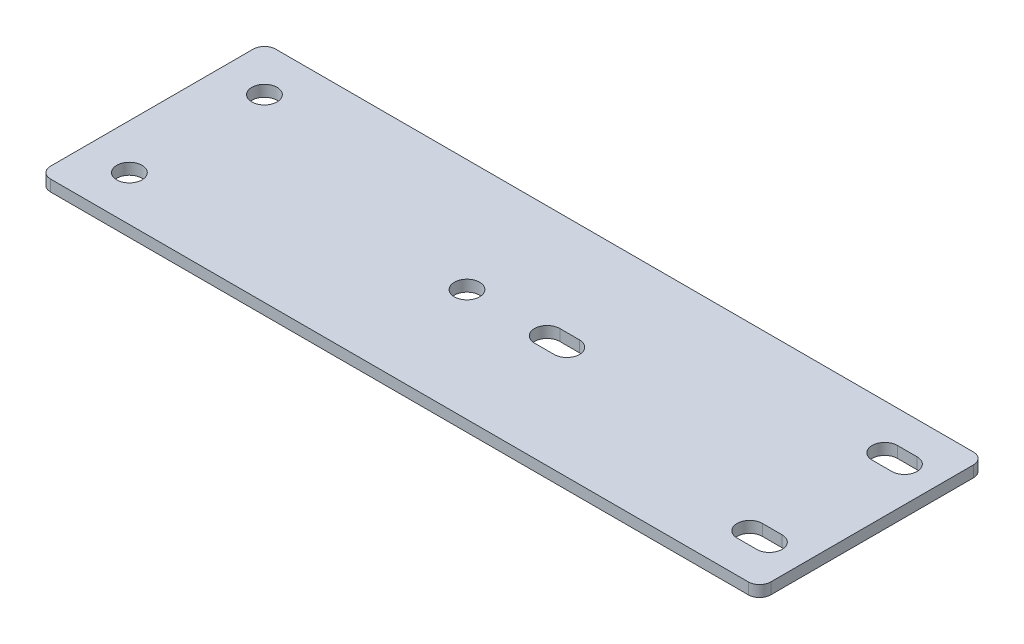
ISO-10303-21;
HEADER;
FILE_DESCRIPTION(('STEP AP214'),'2;1');
FILE_NAME('part.step','',(''),(''),'','','');
FILE_SCHEMA(('AUTOMOTIVE_DESIGN { 1 0 10303 214 1 1 1 1 }'));
ENDSEC;
DATA;
#1=APPLICATION_CONTEXT('core data for automotive mechanical design processes');
#2=APPLICATION_PROTOCOL_DEFINITION('international standard','automotive_design',2000,#1);
#3=PRODUCT_CONTEXT('',#1,'mechanical');
#4=PRODUCT('Part','Part','',(#3));
#5=PRODUCT_RELATED_PRODUCT_CATEGORY('part','',(#4));
#6=PRODUCT_DEFINITION_FORMATION('','',#4);
#7=PRODUCT_DEFINITION_CONTEXT('part definition',#1,'design');
#8=PRODUCT_DEFINITION('design','',#6,#7);
#9=PRODUCT_DEFINITION_SHAPE('','',#8);
#10=(LENGTH_UNIT() NAMED_UNIT(*) SI_UNIT(.MILLI.,.METRE.));
#11=(NAMED_UNIT(*) PLANE_ANGLE_UNIT() SI_UNIT($,.RADIAN.));
#12=(NAMED_UNIT(*) SI_UNIT($,.STERADIAN.) SOLID_ANGLE_UNIT());
#13=UNCERTAINTY_MEASURE_WITH_UNIT(LENGTH_MEASURE(1.E-05),#10,'distance_accuracy_value','');
#14=(GEOMETRIC_REPRESENTATION_CONTEXT(3) GLOBAL_UNCERTAINTY_ASSIGNED_CONTEXT((#13)) GLOBAL_UNIT_ASSIGNED_CONTEXT((#10,
#11,#12)) REPRESENTATION_CONTEXT('',''));
#15=CARTESIAN_POINT('',(0.,0.,0.));
#16=DIRECTION('',(0.,0.,1.));
#17=DIRECTION('',(1.,0.,0.));
#18=AXIS2_PLACEMENT_3D('',#15,#16,#17);
#19=CARTESIAN_POINT('',(0.,3.175,0.));
#20=DIRECTION('',(1.,0.,0.));
#21=DIRECTION('',(0.,0.,-1.));
#22=AXIS2_PLACEMENT_3D('',#19,#20,#21);
#23=PLANE('',#22);
#24=DIRECTION('',(0.,0.,1.));
#25=VECTOR('',#24,1.);
#26=CARTESIAN_POINT('',(0.,3.175,0.));
#27=LINE('',#26,#25);
#28=CARTESIAN_POINT('',(0.,3.175,-60.325));
#29=VERTEX_POINT('',#28);
#30=CARTESIAN_POINT('',(0.,3.175,-3.175));
#31=VERTEX_POINT('',#30);
#32=EDGE_CURVE('E515',#29,#31,#27,.T.);
#33=ORIENTED_EDGE('',*,*,#32,.F.);
#34=DIRECTION('',(0.,-1.,0.));
#35=VECTOR('',#34,1.);
#36=CARTESIAN_POINT('',(0.,3.175,-60.325));
#37=LINE('',#36,#35);
#38=CARTESIAN_POINT('',(0.,0.,-60.325));
#39=VERTEX_POINT('',#38);
#40=EDGE_CURVE('E537',#29,#39,#37,.T.);
#41=ORIENTED_EDGE('',*,*,#40,.T.);
#42=DIRECTION('',(0.,0.,1.));
#43=VECTOR('',#42,1.);
#44=CARTESIAN_POINT('',(0.,0.,0.));
#45=LINE('',#44,#43);
#46=CARTESIAN_POINT('',(0.,0.,-3.175));
#47=VERTEX_POINT('',#46);
#48=EDGE_CURVE('E514',#39,#47,#45,.T.);
#49=ORIENTED_EDGE('',*,*,#48,.T.);
#50=DIRECTION('',(0.,-1.,0.));
#51=VECTOR('',#50,1.);
#52=CARTESIAN_POINT('',(0.,3.175,-3.175));
#53=LINE('',#52,#51);
#54=EDGE_CURVE('E526',#47,#31,#53,.F.);
#55=ORIENTED_EDGE('',*,*,#54,.T.);
#56=EDGE_LOOP('',(#33,#41,#49,#55));
#57=FACE_BOUND('',#56,.T.);
#58=ADVANCED_FACE('F255',(#57),#23,.F.);
#59=CARTESIAN_POINT('',(0.,3.175,0.));
#60=DIRECTION('',(0.,0.,-1.));
#61=DIRECTION('',(-1.,0.,0.));
#62=AXIS2_PLACEMENT_3D('',#59,#60,#61);
#63=PLANE('',#62);
#64=DIRECTION('',(1.,0.,0.));
#65=VECTOR('',#64,1.);
#66=CARTESIAN_POINT('',(0.,3.175,0.));
#67=LINE('',#66,#65);
#68=CARTESIAN_POINT('',(3.175,3.175,0.));
#69=VERTEX_POINT('',#68);
#70=CARTESIAN_POINT('',(200.025,3.175,0.));
#71=VERTEX_POINT('',#70);
#72=EDGE_CURVE('E518',#69,#71,#67,.T.);
#73=ORIENTED_EDGE('',*,*,#72,.F.);
#74=DIRECTION('',(0.,-1.,0.));
#75=VECTOR('',#74,1.);
#76=CARTESIAN_POINT('',(3.175,3.175,0.));
#77=LINE('',#76,#75);
#78=CARTESIAN_POINT('',(3.175,0.,0.));
#79=VERTEX_POINT('',#78);
#80=EDGE_CURVE('E562',#69,#79,#77,.T.);
#81=ORIENTED_EDGE('',*,*,#80,.T.);
#82=DIRECTION('',(1.,0.,0.));
#83=VECTOR('',#82,1.);
#84=CARTESIAN_POINT('',(0.,0.,0.));
#85=LINE('',#84,#83);
#86=CARTESIAN_POINT('',(200.025,0.,0.));
#87=VERTEX_POINT('',#86);
#88=EDGE_CURVE('E529',#79,#87,#85,.T.);
#89=ORIENTED_EDGE('',*,*,#88,.T.);
#90=DIRECTION('',(0.,-1.,0.));
#91=VECTOR('',#90,1.);
#92=CARTESIAN_POINT('',(200.025,3.175,0.));
#93=LINE('',#92,#91);
#94=EDGE_CURVE('E560',#87,#71,#93,.F.);
#95=ORIENTED_EDGE('',*,*,#94,.T.);
#96=EDGE_LOOP('',(#73,#81,#89,#95));
#97=FACE_BOUND('',#96,.T.);
#98=ADVANCED_FACE('F595',(#97),#63,.F.);
#99=CARTESIAN_POINT('',(203.2,3.175,0.));
#100=DIRECTION('',(-1.,0.,0.));
#101=DIRECTION('',(0.,0.,1.));
#102=AXIS2_PLACEMENT_3D('',#99,#100,#101);
#103=PLANE('',#102);
#104=DIRECTION('',(0.,0.,-1.));
#105=VECTOR('',#104,1.);
#106=CARTESIAN_POINT('',(203.2,0.,0.));
#107=LINE('',#106,#105);
#108=CARTESIAN_POINT('',(203.2,0.,-3.175));
#109=VERTEX_POINT('',#108);
#110=CARTESIAN_POINT('',(203.2,0.,-60.325));
#111=VERTEX_POINT('',#110);
#112=EDGE_CURVE('E532',#109,#111,#107,.T.);
#113=ORIENTED_EDGE('',*,*,#112,.T.);
#114=DIRECTION('',(0.,-1.,0.));
#115=VECTOR('',#114,1.);
#116=CARTESIAN_POINT('',(203.2,3.175,-60.325));
#117=LINE('',#116,#115);
#118=CARTESIAN_POINT('',(203.2,3.175,-60.325));
#119=VERTEX_POINT('',#118);
#120=EDGE_CURVE('E13',#111,#119,#117,.F.);
#121=ORIENTED_EDGE('',*,*,#120,.T.);
#122=DIRECTION('',(0.,0.,-1.));
#123=VECTOR('',#122,1.);
#124=CARTESIAN_POINT('',(203.2,3.175,0.));
#125=LINE('',#124,#123);
#126=CARTESIAN_POINT('',(203.2,3.175,-3.175));
#127=VERTEX_POINT('',#126);
#128=EDGE_CURVE('E521',#127,#119,#125,.T.);
#129=ORIENTED_EDGE('',*,*,#128,.F.);
#130=DIRECTION('',(0.,-1.,0.));
#131=VECTOR('',#130,1.);
#132=CARTESIAN_POINT('',(203.2,3.175,-3.175));
#133=LINE('',#132,#131);
#134=EDGE_CURVE('E263',#127,#109,#133,.T.);
#135=ORIENTED_EDGE('',*,*,#134,.T.);
#136=EDGE_LOOP('',(#113,#121,#129,#135));
#137=FACE_BOUND('',#136,.T.);
#138=ADVANCED_FACE('F567',(#137),#103,.F.);
#139=CARTESIAN_POINT('',(0.,3.175,-63.5));
#140=DIRECTION('',(0.,0.,1.));
#141=DIRECTION('',(1.,0.,0.));
#142=AXIS2_PLACEMENT_3D('',#139,#140,#141);
#143=PLANE('',#142);
#144=DIRECTION('',(-1.,0.,0.));
#145=VECTOR('',#144,1.);
#146=CARTESIAN_POINT('',(0.,0.,-63.5));
#147=LINE('',#146,#145);
#148=CARTESIAN_POINT('',(200.025,0.,-63.5));
#149=VERTEX_POINT('',#148);
#150=CARTESIAN_POINT('',(3.175,0.,-63.5));
#151=VERTEX_POINT('',#150);
#152=EDGE_CURVE('E519',#149,#151,#147,.T.);
#153=ORIENTED_EDGE('',*,*,#152,.T.);
#154=DIRECTION('',(0.,-1.,0.));
#155=VECTOR('',#154,1.);
#156=CARTESIAN_POINT('',(3.175,3.175,-63.5));
#157=LINE('',#156,#155);
#158=CARTESIAN_POINT('',(3.175,3.175,-63.5));
#159=VERTEX_POINT('',#158);
#160=EDGE_CURVE('E551',#151,#159,#157,.F.);
#161=ORIENTED_EDGE('',*,*,#160,.T.);
#162=DIRECTION('',(-1.,0.,0.));
#163=VECTOR('',#162,1.);
#164=CARTESIAN_POINT('',(0.,3.175,-63.5));
#165=LINE('',#164,#163);
#166=CARTESIAN_POINT('',(200.025,3.175,-63.5));
#167=VERTEX_POINT('',#166);
#168=EDGE_CURVE('E523',#167,#159,#165,.T.);
#169=ORIENTED_EDGE('',*,*,#168,.F.);
#170=DIRECTION('',(0.,-1.,0.));
#171=VECTOR('',#170,1.);
#172=CARTESIAN_POINT('',(200.025,3.175,-63.5));
#173=LINE('',#172,#171);
#174=EDGE_CURVE('E548',#167,#149,#173,.T.);
#175=ORIENTED_EDGE('',*,*,#174,.T.);
#176=EDGE_LOOP('',(#153,#161,#169,#175));
#177=FACE_BOUND('',#176,.T.);
#178=ADVANCED_FACE('F580',(#177),#143,.F.);
#179=CARTESIAN_POINT('',(0.,3.175,0.));
#180=DIRECTION('',(0.,-1.,0.));
#181=DIRECTION('',(0.,0.,-1.));
#182=AXIS2_PLACEMENT_3D('',#179,#180,#181);
#183=PLANE('',#182);
#184=DIRECTION('',(1.,0.,0.));
#185=VECTOR('',#184,1.);
#186=CARTESIAN_POINT('',(111.521875,3.175,-28.178125));
#187=LINE('',#186,#185);
#188=CARTESIAN_POINT('',(111.521875,3.175,-28.178125));
#189=VERTEX_POINT('',#188);
#190=CARTESIAN_POINT('',(117.078125,3.175,-28.178125));
#191=VERTEX_POINT('',#190);
#192=EDGE_CURVE('E418',#189,#191,#187,.T.);
#193=ORIENTED_EDGE('',*,*,#192,.F.);
#194=CARTESIAN_POINT('',(111.521875,3.175,-31.75));
#195=DIRECTION('',(0.,1.,0.));
#196=DIRECTION('',(0.,0.,1.));
#197=AXIS2_PLACEMENT_3D('',#194,#195,#196);
#198=CIRCLE('',#197,3.571875);
#199=CARTESIAN_POINT('',(111.521875,3.175,-35.321875));
#200=VERTEX_POINT('',#199);
#201=EDGE_CURVE('E403',#200,#189,#198,.T.);
#202=ORIENTED_EDGE('',*,*,#201,.F.);
#203=DIRECTION('',(1.,0.,0.));
#204=VECTOR('',#203,1.);
#205=CARTESIAN_POINT('',(111.521875,3.175,-35.321875));
#206=LINE('',#205,#204);
#207=CARTESIAN_POINT('',(117.078125,3.175,-35.321875));
#208=VERTEX_POINT('',#207);
#209=EDGE_CURVE('E392',#200,#208,#206,.T.);
#210=ORIENTED_EDGE('',*,*,#209,.T.);
#211=CARTESIAN_POINT('',(117.078125,3.175,-31.75));
#212=DIRECTION('',(0.,1.,0.));
#213=DIRECTION('',(0.,0.,1.));
#214=AXIS2_PLACEMENT_3D('',#211,#212,#213);
#215=CIRCLE('',#214,3.571875);
#216=EDGE_CURVE('E412',#191,#208,#215,.T.);
#217=ORIENTED_EDGE('',*,*,#216,.F.);
#218=EDGE_LOOP('',(#193,#202,#210,#217));
#219=FACE_BOUND('',#218,.T.);
#220=DIRECTION('',(1.,0.,0.));
#221=VECTOR('',#220,1.);
#222=CARTESIAN_POINT('',(187.721875,3.175,-54.371875));
#223=LINE('',#222,#221);
#224=CARTESIAN_POINT('',(187.721875,3.175,-54.371875));
#225=VERTEX_POINT('',#224);
#226=CARTESIAN_POINT('',(193.278125,3.175,-54.371875));
#227=VERTEX_POINT('',#226);
#228=EDGE_CURVE('E439',#225,#227,#223,.T.);
#229=ORIENTED_EDGE('',*,*,#228,.T.);
#230=CARTESIAN_POINT('',(193.278125,3.175,-50.8));
#231=DIRECTION('',(0.,1.,0.));
#232=DIRECTION('',(0.,0.,1.));
#233=AXIS2_PLACEMENT_3D('',#230,#231,#232);
#234=CIRCLE('',#233,3.571875);
#235=CARTESIAN_POINT('',(193.278125,3.175,-47.228125));
#236=VERTEX_POINT('',#235);
#237=EDGE_CURVE('E453',#236,#227,#234,.T.);
#238=ORIENTED_EDGE('',*,*,#237,.F.);
#239=DIRECTION('',(1.,0.,0.));
#240=VECTOR('',#239,1.);
#241=CARTESIAN_POINT('',(187.721875,3.175,-47.228125));
#242=LINE('',#241,#240);
#243=CARTESIAN_POINT('',(187.721875,3.175,-47.228125));
#244=VERTEX_POINT('',#243);
#245=EDGE_CURVE('E432',#244,#236,#242,.T.);
#246=ORIENTED_EDGE('',*,*,#245,.F.);
#247=CARTESIAN_POINT('',(187.721875,3.175,-50.8));
#248=DIRECTION('',(0.,1.,0.));
#249=DIRECTION('',(0.,0.,1.));
#250=AXIS2_PLACEMENT_3D('',#247,#248,#249);
#251=CIRCLE('',#250,3.571875);
#252=EDGE_CURVE('E442',#225,#244,#251,.T.);
#253=ORIENTED_EDGE('',*,*,#252,.F.);
#254=EDGE_LOOP('',(#229,#238,#246,#253));
#255=FACE_BOUND('',#254,.T.);
#256=CARTESIAN_POINT('',(187.721875,3.175,-12.7));
#257=DIRECTION('',(0.,1.,0.));
#258=DIRECTION('',(0.,0.,1.));
#259=AXIS2_PLACEMENT_3D('',#256,#257,#258);
#260=CIRCLE('',#259,3.571875);
#261=CARTESIAN_POINT('',(187.721875,3.175,-16.271875));
#262=VERTEX_POINT('',#261);
#263=CARTESIAN_POINT('',(187.721875,3.175,-9.128125));
#264=VERTEX_POINT('',#263);
#265=EDGE_CURVE('E474',#262,#264,#260,.T.);
#266=ORIENTED_EDGE('',*,*,#265,.F.);
#267=DIRECTION('',(1.,0.,0.));
#268=VECTOR('',#267,1.);
#269=CARTESIAN_POINT('',(187.721875,3.175,-16.271875));
#270=LINE('',#269,#268);
#271=CARTESIAN_POINT('',(193.278125,3.175,-16.271875));
#272=VERTEX_POINT('',#271);
#273=EDGE_CURVE('E471',#262,#272,#270,.T.);
#274=ORIENTED_EDGE('',*,*,#273,.T.);
#275=CARTESIAN_POINT('',(193.278125,3.175,-12.7));
#276=DIRECTION('',(0.,1.,0.));
#277=DIRECTION('',(0.,0.,1.));
#278=AXIS2_PLACEMENT_3D('',#275,#276,#277);
#279=CIRCLE('',#278,3.571875);
#280=CARTESIAN_POINT('',(193.278125,3.175,-9.12812499999995));
#281=VERTEX_POINT('',#280);
#282=EDGE_CURVE('E485',#281,#272,#279,.T.);
#283=ORIENTED_EDGE('',*,*,#282,.F.);
#284=DIRECTION('',(1.,0.,0.));
#285=VECTOR('',#284,1.);
#286=CARTESIAN_POINT('',(187.721875,3.175,-9.12812499999995));
#287=LINE('',#286,#285);
#288=EDGE_CURVE('E464',#264,#281,#287,.T.);
#289=ORIENTED_EDGE('',*,*,#288,.F.);
#290=EDGE_LOOP('',(#266,#274,#283,#289));
#291=FACE_BOUND('',#290,.T.);
#292=CARTESIAN_POINT('',(12.7,3.175,-12.7));
#293=DIRECTION('',(0.,1.,0.));
#294=DIRECTION('',(0.,0.,1.));
#295=AXIS2_PLACEMENT_3D('',#292,#293,#294);
#296=CIRCLE('',#295,3.571875);
#297=CARTESIAN_POINT('',(12.7,3.175,-9.128125));
#298=VERTEX_POINT('',#297);
#299=EDGE_CURVE('E496',#298,#298,#296,.T.);
#300=ORIENTED_EDGE('',*,*,#299,.F.);
#301=EDGE_LOOP('',(#300));
#302=FACE_BOUND('',#301,.T.);
#303=CARTESIAN_POINT('',(12.7,3.175,-50.8));
#304=DIRECTION('',(0.,1.,0.));
#305=DIRECTION('',(0.,0.,1.));
#306=AXIS2_PLACEMENT_3D('',#303,#304,#305);
#307=CIRCLE('',#306,3.571875);
#308=CARTESIAN_POINT('',(12.7,3.175,-47.228125));
#309=VERTEX_POINT('',#308);
#310=EDGE_CURVE('E502',#309,#309,#307,.T.);
#311=ORIENTED_EDGE('',*,*,#310,.F.);
#312=EDGE_LOOP('',(#311));
#313=FACE_BOUND('',#312,.T.);
#314=CARTESIAN_POINT('',(88.9,3.175,-31.75));
#315=DIRECTION('',(0.,1.,0.));
#316=DIRECTION('',(0.,0.,1.));
#317=AXIS2_PLACEMENT_3D('',#314,#315,#316);
#318=CIRCLE('',#317,3.571875);
#319=CARTESIAN_POINT('',(88.9,3.175,-28.178125));
#320=VERTEX_POINT('',#319);
#321=EDGE_CURVE('E508',#320,#320,#318,.T.);
#322=ORIENTED_EDGE('',*,*,#321,.F.);
#323=EDGE_LOOP('',(#322));
#324=FACE_BOUND('',#323,.T.);
#325=ORIENTED_EDGE('',*,*,#168,.T.);
#326=CARTESIAN_POINT('',(3.175,3.175,-60.325));
#327=DIRECTION('',(0.,-1.,0.));
#328=DIRECTION('',(0.,0.,-1.));
#329=AXIS2_PLACEMENT_3D('',#326,#327,#328);
#330=CIRCLE('',#329,3.175);
#331=EDGE_CURVE('E558',#159,#29,#330,.F.);
#332=ORIENTED_EDGE('',*,*,#331,.T.);
#333=ORIENTED_EDGE('',*,*,#32,.T.);
#334=CARTESIAN_POINT('',(3.175,3.175,-3.175));
#335=DIRECTION('',(0.,-1.,0.));
#336=DIRECTION('',(0.,0.,-1.));
#337=AXIS2_PLACEMENT_3D('',#334,#335,#336);
#338=CIRCLE('',#337,3.175);
#339=EDGE_CURVE('E556',#31,#69,#338,.F.);
#340=ORIENTED_EDGE('',*,*,#339,.T.);
#341=ORIENTED_EDGE('',*,*,#72,.T.);
#342=CARTESIAN_POINT('',(200.025,3.175,-3.175));
#343=DIRECTION('',(0.,-1.,0.));
#344=DIRECTION('',(0.,0.,-1.));
#345=AXIS2_PLACEMENT_3D('',#342,#343,#344);
#346=CIRCLE('',#345,3.175);
#347=EDGE_CURVE('E275',#71,#127,#346,.F.);
#348=ORIENTED_EDGE('',*,*,#347,.T.);
#349=ORIENTED_EDGE('',*,*,#128,.T.);
#350=CARTESIAN_POINT('',(200.025,3.175,-60.325));
#351=DIRECTION('',(0.,-1.,0.));
#352=DIRECTION('',(0.,0.,-1.));
#353=AXIS2_PLACEMENT_3D('',#350,#351,#352);
#354=CIRCLE('',#353,3.175);
#355=EDGE_CURVE('E554',#119,#167,#354,.F.);
#356=ORIENTED_EDGE('',*,*,#355,.T.);
#357=EDGE_LOOP('',(#325,#332,#333,#340,#341,#348,#349,#356));
#358=FACE_BOUND('',#357,.T.);
#359=ADVANCED_FACE('F416',(#219,#255,#291,#302,#313,#324,#358),#183,.F.);
#360=CARTESIAN_POINT('',(0.,0.,0.));
#361=DIRECTION('',(0.,-1.,0.));
#362=DIRECTION('',(0.,0.,-1.));
#363=AXIS2_PLACEMENT_3D('',#360,#361,#362);
#364=PLANE('',#363);
#365=CARTESIAN_POINT('',(117.078125,0.,-31.75));
#366=DIRECTION('',(0.,1.,0.));
#367=DIRECTION('',(0.,0.,1.));
#368=AXIS2_PLACEMENT_3D('',#365,#366,#367);
#369=CIRCLE('',#368,3.571875);
#370=CARTESIAN_POINT('',(117.078125,0.,-28.178125));
#371=VERTEX_POINT('',#370);
#372=CARTESIAN_POINT('',(117.078125,0.,-35.321875));
#373=VERTEX_POINT('',#372);
#374=EDGE_CURVE('E425',#371,#373,#369,.T.);
#375=ORIENTED_EDGE('',*,*,#374,.T.);
#376=DIRECTION('',(1.,0.,0.));
#377=VECTOR('',#376,1.);
#378=CARTESIAN_POINT('',(111.521875,0.,-35.321875));
#379=LINE('',#378,#377);
#380=CARTESIAN_POINT('',(111.521875,0.,-35.321875));
#381=VERTEX_POINT('',#380);
#382=EDGE_CURVE('E404',#381,#373,#379,.T.);
#383=ORIENTED_EDGE('',*,*,#382,.F.);
#384=CARTESIAN_POINT('',(111.521875,0.,-31.75));
#385=DIRECTION('',(0.,1.,0.));
#386=DIRECTION('',(0.,0.,1.));
#387=AXIS2_PLACEMENT_3D('',#384,#385,#386);
#388=CIRCLE('',#387,3.571875);
#389=CARTESIAN_POINT('',(111.521875,0.,-28.178125));
#390=VERTEX_POINT('',#389);
#391=EDGE_CURVE('E411',#381,#390,#388,.T.);
#392=ORIENTED_EDGE('',*,*,#391,.T.);
#393=DIRECTION('',(1.,0.,0.));
#394=VECTOR('',#393,1.);
#395=CARTESIAN_POINT('',(111.521875,0.,-28.178125));
#396=LINE('',#395,#394);
#397=EDGE_CURVE('E857',#390,#371,#396,.T.);
#398=ORIENTED_EDGE('',*,*,#397,.T.);
#399=EDGE_LOOP('',(#375,#383,#392,#398));
#400=FACE_BOUND('',#399,.T.);
#401=DIRECTION('',(1.,0.,0.));
#402=VECTOR('',#401,1.);
#403=CARTESIAN_POINT('',(187.721875,0.,-47.228125));
#404=LINE('',#403,#402);
#405=CARTESIAN_POINT('',(187.721875,0.,-47.228125));
#406=VERTEX_POINT('',#405);
#407=CARTESIAN_POINT('',(193.278125,0.,-47.228125));
#408=VERTEX_POINT('',#407);
#409=EDGE_CURVE('E434',#406,#408,#404,.T.);
#410=ORIENTED_EDGE('',*,*,#409,.T.);
#411=CARTESIAN_POINT('',(193.278125,0.,-50.8));
#412=DIRECTION('',(0.,1.,0.));
#413=DIRECTION('',(0.,0.,1.));
#414=AXIS2_PLACEMENT_3D('',#411,#412,#413);
#415=CIRCLE('',#414,3.571875);
#416=CARTESIAN_POINT('',(193.278125,0.,-54.371875));
#417=VERTEX_POINT('',#416);
#418=EDGE_CURVE('E456',#408,#417,#415,.T.);
#419=ORIENTED_EDGE('',*,*,#418,.T.);
#420=DIRECTION('',(1.,0.,0.));
#421=VECTOR('',#420,1.);
#422=CARTESIAN_POINT('',(187.721875,0.,-54.371875));
#423=LINE('',#422,#421);
#424=CARTESIAN_POINT('',(187.721875,0.,-54.371875));
#425=VERTEX_POINT('',#424);
#426=EDGE_CURVE('E437',#425,#417,#423,.T.);
#427=ORIENTED_EDGE('',*,*,#426,.F.);
#428=CARTESIAN_POINT('',(187.721875,0.,-50.8));
#429=DIRECTION('',(0.,1.,0.));
#430=DIRECTION('',(0.,0.,1.));
#431=AXIS2_PLACEMENT_3D('',#428,#429,#430);
#432=CIRCLE('',#431,3.571875);
#433=EDGE_CURVE('E444',#425,#406,#432,.T.);
#434=ORIENTED_EDGE('',*,*,#433,.T.);
#435=EDGE_LOOP('',(#410,#419,#427,#434));
#436=FACE_BOUND('',#435,.T.);
#437=DIRECTION('',(1.,0.,0.));
#438=VECTOR('',#437,1.);
#439=CARTESIAN_POINT('',(187.721875,0.,-9.128125));
#440=LINE('',#439,#438);
#441=CARTESIAN_POINT('',(187.721875,0.,-9.128125));
#442=VERTEX_POINT('',#441);
#443=CARTESIAN_POINT('',(193.278125,0.,-9.128125));
#444=VERTEX_POINT('',#443);
#445=EDGE_CURVE('E466',#442,#444,#440,.T.);
#446=ORIENTED_EDGE('',*,*,#445,.T.);
#447=CARTESIAN_POINT('',(193.278125,0.,-12.7));
#448=DIRECTION('',(0.,1.,0.));
#449=DIRECTION('',(0.,0.,1.));
#450=AXIS2_PLACEMENT_3D('',#447,#448,#449);
#451=CIRCLE('',#450,3.571875);
#452=CARTESIAN_POINT('',(193.278125,0.,-16.271875));
#453=VERTEX_POINT('',#452);
#454=EDGE_CURVE('E488',#444,#453,#451,.T.);
#455=ORIENTED_EDGE('',*,*,#454,.T.);
#456=DIRECTION('',(1.,0.,0.));
#457=VECTOR('',#456,1.);
#458=CARTESIAN_POINT('',(187.721875,0.,-16.271875));
#459=LINE('',#458,#457);
#460=CARTESIAN_POINT('',(187.721875,0.,-16.271875));
#461=VERTEX_POINT('',#460);
#462=EDGE_CURVE('E469',#461,#453,#459,.T.);
#463=ORIENTED_EDGE('',*,*,#462,.F.);
#464=CARTESIAN_POINT('',(187.721875,0.,-12.7));
#465=DIRECTION('',(0.,1.,0.));
#466=DIRECTION('',(0.,0.,1.));
#467=AXIS2_PLACEMENT_3D('',#464,#465,#466);
#468=CIRCLE('',#467,3.571875);
#469=EDGE_CURVE('E477',#461,#442,#468,.T.);
#470=ORIENTED_EDGE('',*,*,#469,.T.);
#471=EDGE_LOOP('',(#446,#455,#463,#470));
#472=FACE_BOUND('',#471,.T.);
#473=CARTESIAN_POINT('',(12.7,0.,-12.7));
#474=DIRECTION('',(0.,1.,0.));
#475=DIRECTION('',(0.,0.,1.));
#476=AXIS2_PLACEMENT_3D('',#473,#474,#475);
#477=CIRCLE('',#476,3.571875);
#478=CARTESIAN_POINT('',(12.7,0.,-9.128125));
#479=VERTEX_POINT('',#478);
#480=EDGE_CURVE('E499',#479,#479,#477,.T.);
#481=ORIENTED_EDGE('',*,*,#480,.T.);
#482=EDGE_LOOP('',(#481));
#483=FACE_BOUND('',#482,.T.);
#484=CARTESIAN_POINT('',(12.7,0.,-50.8));
#485=DIRECTION('',(0.,1.,0.));
#486=DIRECTION('',(0.,0.,1.));
#487=AXIS2_PLACEMENT_3D('',#484,#485,#486);
#488=CIRCLE('',#487,3.571875);
#489=CARTESIAN_POINT('',(12.7,0.,-47.228125));
#490=VERTEX_POINT('',#489);
#491=EDGE_CURVE('E505',#490,#490,#488,.T.);
#492=ORIENTED_EDGE('',*,*,#491,.T.);
#493=EDGE_LOOP('',(#492));
#494=FACE_BOUND('',#493,.T.);
#495=CARTESIAN_POINT('',(88.9,0.,-31.75));
#496=DIRECTION('',(0.,1.,0.));
#497=DIRECTION('',(0.,0.,1.));
#498=AXIS2_PLACEMENT_3D('',#495,#496,#497);
#499=CIRCLE('',#498,3.571875);
#500=CARTESIAN_POINT('',(88.9,0.,-28.178125));
#501=VERTEX_POINT('',#500);
#502=EDGE_CURVE('E511',#501,#501,#499,.T.);
#503=ORIENTED_EDGE('',*,*,#502,.T.);
#504=EDGE_LOOP('',(#503));
#505=FACE_BOUND('',#504,.T.);
#506=ORIENTED_EDGE('',*,*,#48,.F.);
#507=CARTESIAN_POINT('',(3.175,0.,-60.325));
#508=DIRECTION('',(0.,-1.,0.));
#509=DIRECTION('',(0.,0.,-1.));
#510=AXIS2_PLACEMENT_3D('',#507,#508,#509);
#511=CIRCLE('',#510,3.175);
#512=EDGE_CURVE('E546',#39,#151,#511,.T.);
#513=ORIENTED_EDGE('',*,*,#512,.T.);
#514=ORIENTED_EDGE('',*,*,#152,.F.);
#515=CARTESIAN_POINT('',(200.025,0.,-60.325));
#516=DIRECTION('',(0.,-1.,0.));
#517=DIRECTION('',(0.,0.,-1.));
#518=AXIS2_PLACEMENT_3D('',#515,#516,#517);
#519=CIRCLE('',#518,3.175);
#520=EDGE_CURVE('E542',#149,#111,#519,.T.);
#521=ORIENTED_EDGE('',*,*,#520,.T.);
#522=ORIENTED_EDGE('',*,*,#112,.F.);
#523=CARTESIAN_POINT('',(200.025,0.,-3.175));
#524=DIRECTION('',(0.,-1.,0.));
#525=DIRECTION('',(0.,0.,-1.));
#526=AXIS2_PLACEMENT_3D('',#523,#524,#525);
#527=CIRCLE('',#526,3.175);
#528=EDGE_CURVE('E540',#109,#87,#527,.T.);
#529=ORIENTED_EDGE('',*,*,#528,.T.);
#530=ORIENTED_EDGE('',*,*,#88,.F.);
#531=CARTESIAN_POINT('',(3.175,0.,-3.175));
#532=DIRECTION('',(0.,-1.,0.));
#533=DIRECTION('',(0.,0.,-1.));
#534=AXIS2_PLACEMENT_3D('',#531,#532,#533);
#535=CIRCLE('',#534,3.175);
#536=EDGE_CURVE('E544',#79,#47,#535,.T.);
#537=ORIENTED_EDGE('',*,*,#536,.T.);
#538=EDGE_LOOP('',(#506,#513,#514,#521,#522,#529,#530,#537));
#539=FACE_BOUND('',#538,.T.);
#540=ADVANCED_FACE('F571',(#400,#436,#472,#483,#494,#505,#539),#364,.T.);
#541=CARTESIAN_POINT('',(88.9,3.175,-31.75));
#542=DIRECTION('',(0.,1.,0.));
#543=DIRECTION('',(0.,0.,1.));
#544=AXIS2_PLACEMENT_3D('',#541,#542,#543);
#545=CYLINDRICAL_SURFACE('',#544,3.571875);
#546=ORIENTED_EDGE('',*,*,#502,.F.);
#547=EDGE_LOOP('',(#546));
#548=FACE_BOUND('',#547,.T.);
#549=ORIENTED_EDGE('',*,*,#321,.T.);
#550=EDGE_LOOP('',(#549));
#551=FACE_BOUND('',#550,.T.);
#552=ADVANCED_FACE('F755',(#548,#551),#545,.F.);
#553=CARTESIAN_POINT('',(12.7,3.175,-50.8));
#554=DIRECTION('',(0.,1.,0.));
#555=DIRECTION('',(0.,0.,1.));
#556=AXIS2_PLACEMENT_3D('',#553,#554,#555);
#557=CYLINDRICAL_SURFACE('',#556,3.571875);
#558=ORIENTED_EDGE('',*,*,#491,.F.);
#559=EDGE_LOOP('',(#558));
#560=FACE_BOUND('',#559,.T.);
#561=ORIENTED_EDGE('',*,*,#310,.T.);
#562=EDGE_LOOP('',(#561));
#563=FACE_BOUND('',#562,.T.);
#564=ADVANCED_FACE('F746',(#560,#563),#557,.F.);
#565=CARTESIAN_POINT('',(12.7,3.175,-12.7));
#566=DIRECTION('',(0.,1.,0.));
#567=DIRECTION('',(0.,0.,1.));
#568=AXIS2_PLACEMENT_3D('',#565,#566,#567);
#569=CYLINDRICAL_SURFACE('',#568,3.571875);
#570=ORIENTED_EDGE('',*,*,#480,.F.);
#571=EDGE_LOOP('',(#570));
#572=FACE_BOUND('',#571,.T.);
#573=ORIENTED_EDGE('',*,*,#299,.T.);
#574=EDGE_LOOP('',(#573));
#575=FACE_BOUND('',#574,.T.);
#576=ADVANCED_FACE('F737',(#572,#575),#569,.F.);
#577=CARTESIAN_POINT('',(193.278125,3.175,-12.7));
#578=DIRECTION('',(0.,1.,0.));
#579=DIRECTION('',(0.,0.,1.));
#580=AXIS2_PLACEMENT_3D('',#577,#578,#579);
#581=CYLINDRICAL_SURFACE('',#580,3.571875);
#582=ORIENTED_EDGE('',*,*,#454,.F.);
#583=DIRECTION('',(0.,1.,0.));
#584=VECTOR('',#583,1.);
#585=CARTESIAN_POINT('',(193.278125,3.175,-9.128125));
#586=LINE('',#585,#584);
#587=EDGE_CURVE('E493',#281,#444,#586,.F.);
#588=ORIENTED_EDGE('',*,*,#587,.F.);
#589=ORIENTED_EDGE('',*,*,#282,.T.);
#590=DIRECTION('',(0.,1.,0.));
#591=VECTOR('',#590,1.);
#592=CARTESIAN_POINT('',(193.278125,3.175,-16.271875));
#593=LINE('',#592,#591);
#594=EDGE_CURVE('E491',#453,#272,#593,.T.);
#595=ORIENTED_EDGE('',*,*,#594,.F.);
#596=EDGE_LOOP('',(#582,#588,#589,#595));
#597=FACE_BOUND('',#596,.T.);
#598=ADVANCED_FACE('F728',(#597),#581,.F.);
#599=CARTESIAN_POINT('',(187.721875,3.175,-12.7));
#600=DIRECTION('',(0.,1.,0.));
#601=DIRECTION('',(0.,0.,1.));
#602=AXIS2_PLACEMENT_3D('',#599,#600,#601);
#603=CYLINDRICAL_SURFACE('',#602,3.571875);
#604=ORIENTED_EDGE('',*,*,#265,.T.);
#605=DIRECTION('',(0.,1.,0.));
#606=VECTOR('',#605,1.);
#607=CARTESIAN_POINT('',(187.721875,3.175,-9.128125));
#608=LINE('',#607,#606);
#609=EDGE_CURVE('E480',#442,#264,#608,.T.);
#610=ORIENTED_EDGE('',*,*,#609,.F.);
#611=ORIENTED_EDGE('',*,*,#469,.F.);
#612=DIRECTION('',(0.,1.,0.));
#613=VECTOR('',#612,1.);
#614=CARTESIAN_POINT('',(187.721875,3.175,-16.271875));
#615=LINE('',#614,#613);
#616=EDGE_CURVE('E482',#262,#461,#615,.F.);
#617=ORIENTED_EDGE('',*,*,#616,.F.);
#618=EDGE_LOOP('',(#604,#610,#611,#617));
#619=FACE_BOUND('',#618,.T.);
#620=ADVANCED_FACE('F719',(#619),#603,.F.);
#621=CARTESIAN_POINT('',(187.721875,3.175,-16.271875));
#622=DIRECTION('',(0.,0.,-1.));
#623=DIRECTION('',(-1.,0.,0.));
#624=AXIS2_PLACEMENT_3D('',#621,#622,#623);
#625=PLANE('',#624);
#626=ORIENTED_EDGE('',*,*,#594,.T.);
#627=ORIENTED_EDGE('',*,*,#273,.F.);
#628=ORIENTED_EDGE('',*,*,#616,.T.);
#629=ORIENTED_EDGE('',*,*,#462,.T.);
#630=EDGE_LOOP('',(#626,#627,#628,#629));
#631=FACE_BOUND('',#630,.T.);
#632=ADVANCED_FACE('F710',(#631),#625,.F.);
#633=CARTESIAN_POINT('',(187.721875,3.175,-9.128125));
#634=DIRECTION('',(0.,0.,1.));
#635=DIRECTION('',(1.,0.,0.));
#636=AXIS2_PLACEMENT_3D('',#633,#634,#635);
#637=PLANE('',#636);
#638=ORIENTED_EDGE('',*,*,#587,.T.);
#639=ORIENTED_EDGE('',*,*,#445,.F.);
#640=ORIENTED_EDGE('',*,*,#609,.T.);
#641=ORIENTED_EDGE('',*,*,#288,.T.);
#642=EDGE_LOOP('',(#638,#639,#640,#641));
#643=FACE_BOUND('',#642,.T.);
#644=ADVANCED_FACE('F701',(#643),#637,.F.);
#645=CARTESIAN_POINT('',(193.278125,3.175,-50.8));
#646=DIRECTION('',(0.,1.,0.));
#647=DIRECTION('',(0.,0.,1.));
#648=AXIS2_PLACEMENT_3D('',#645,#646,#647);
#649=CYLINDRICAL_SURFACE('',#648,3.571875);
#650=ORIENTED_EDGE('',*,*,#418,.F.);
#651=DIRECTION('',(0.,1.,0.));
#652=VECTOR('',#651,1.);
#653=CARTESIAN_POINT('',(193.278125,3.175,-47.228125));
#654=LINE('',#653,#652);
#655=EDGE_CURVE('E461',#236,#408,#654,.F.);
#656=ORIENTED_EDGE('',*,*,#655,.F.);
#657=ORIENTED_EDGE('',*,*,#237,.T.);
#658=DIRECTION('',(0.,1.,0.));
#659=VECTOR('',#658,1.);
#660=CARTESIAN_POINT('',(193.278125,3.175,-54.371875));
#661=LINE('',#660,#659);
#662=EDGE_CURVE('E459',#417,#227,#661,.T.);
#663=ORIENTED_EDGE('',*,*,#662,.F.);
#664=EDGE_LOOP('',(#650,#656,#657,#663));
#665=FACE_BOUND('',#664,.T.);
#666=ADVANCED_FACE('F692',(#665),#649,.F.);
#667=CARTESIAN_POINT('',(187.721875,3.175,-50.8));
#668=DIRECTION('',(0.,1.,0.));
#669=DIRECTION('',(0.,0.,1.));
#670=AXIS2_PLACEMENT_3D('',#667,#668,#669);
#671=CYLINDRICAL_SURFACE('',#670,3.571875);
#672=ORIENTED_EDGE('',*,*,#252,.T.);
#673=DIRECTION('',(0.,1.,0.));
#674=VECTOR('',#673,1.);
#675=CARTESIAN_POINT('',(187.721875,3.175,-47.228125));
#676=LINE('',#675,#674);
#677=EDGE_CURVE('E447',#406,#244,#676,.T.);
#678=ORIENTED_EDGE('',*,*,#677,.F.);
#679=ORIENTED_EDGE('',*,*,#433,.F.);
#680=DIRECTION('',(0.,1.,0.));
#681=VECTOR('',#680,1.);
#682=CARTESIAN_POINT('',(187.721875,3.175,-54.371875));
#683=LINE('',#682,#681);
#684=EDGE_CURVE('E450',#225,#425,#683,.F.);
#685=ORIENTED_EDGE('',*,*,#684,.F.);
#686=EDGE_LOOP('',(#672,#678,#679,#685));
#687=FACE_BOUND('',#686,.T.);
#688=ADVANCED_FACE('F683',(#687),#671,.F.);
#689=CARTESIAN_POINT('',(187.721875,3.175,-54.371875));
#690=DIRECTION('',(0.,0.,-1.));
#691=DIRECTION('',(-1.,0.,0.));
#692=AXIS2_PLACEMENT_3D('',#689,#690,#691);
#693=PLANE('',#692);
#694=ORIENTED_EDGE('',*,*,#662,.T.);
#695=ORIENTED_EDGE('',*,*,#228,.F.);
#696=ORIENTED_EDGE('',*,*,#684,.T.);
#697=ORIENTED_EDGE('',*,*,#426,.T.);
#698=EDGE_LOOP('',(#694,#695,#696,#697));
#699=FACE_BOUND('',#698,.T.);
#700=ADVANCED_FACE('F674',(#699),#693,.F.);
#701=CARTESIAN_POINT('',(187.721875,3.175,-47.228125));
#702=DIRECTION('',(0.,0.,1.));
#703=DIRECTION('',(1.,0.,0.));
#704=AXIS2_PLACEMENT_3D('',#701,#702,#703);
#705=PLANE('',#704);
#706=ORIENTED_EDGE('',*,*,#655,.T.);
#707=ORIENTED_EDGE('',*,*,#409,.F.);
#708=ORIENTED_EDGE('',*,*,#677,.T.);
#709=ORIENTED_EDGE('',*,*,#245,.T.);
#710=EDGE_LOOP('',(#706,#707,#708,#709));
#711=FACE_BOUND('',#710,.T.);
#712=ADVANCED_FACE('F665',(#711),#705,.F.);
#713=CARTESIAN_POINT('',(117.078125,3.175,-31.75));
#714=DIRECTION('',(0.,1.,0.));
#715=DIRECTION('',(0.,0.,1.));
#716=AXIS2_PLACEMENT_3D('',#713,#714,#715);
#717=CYLINDRICAL_SURFACE('',#716,3.571875);
#718=ORIENTED_EDGE('',*,*,#374,.F.);
#719=DIRECTION('',(0.,1.,0.));
#720=VECTOR('',#719,1.);
#721=CARTESIAN_POINT('',(117.078125,3.175,-28.178125));
#722=LINE('',#721,#720);
#723=EDGE_CURVE('E429',#191,#371,#722,.F.);
#724=ORIENTED_EDGE('',*,*,#723,.F.);
#725=ORIENTED_EDGE('',*,*,#216,.T.);
#726=DIRECTION('',(0.,1.,0.));
#727=VECTOR('',#726,1.);
#728=CARTESIAN_POINT('',(117.078125,3.175,-35.321875));
#729=LINE('',#728,#727);
#730=EDGE_CURVE('E398',#373,#208,#729,.T.);
#731=ORIENTED_EDGE('',*,*,#730,.F.);
#732=EDGE_LOOP('',(#718,#724,#725,#731));
#733=FACE_BOUND('',#732,.T.);
#734=ADVANCED_FACE('F657',(#733),#717,.F.);
#735=CARTESIAN_POINT('',(111.521875,3.175,-31.75));
#736=DIRECTION('',(0.,1.,0.));
#737=DIRECTION('',(0.,0.,1.));
#738=AXIS2_PLACEMENT_3D('',#735,#736,#737);
#739=CYLINDRICAL_SURFACE('',#738,3.571875);
#740=ORIENTED_EDGE('',*,*,#201,.T.);
#741=DIRECTION('',(0.,1.,0.));
#742=VECTOR('',#741,1.);
#743=CARTESIAN_POINT('',(111.521875,3.175,-28.178125));
#744=LINE('',#743,#742);
#745=EDGE_CURVE('E413',#390,#189,#744,.T.);
#746=ORIENTED_EDGE('',*,*,#745,.F.);
#747=ORIENTED_EDGE('',*,*,#391,.F.);
#748=DIRECTION('',(0.,1.,0.));
#749=VECTOR('',#748,1.);
#750=CARTESIAN_POINT('',(111.521875,3.175,-35.321875));
#751=LINE('',#750,#749);
#752=EDGE_CURVE('E395',#200,#381,#751,.F.);
#753=ORIENTED_EDGE('',*,*,#752,.F.);
#754=EDGE_LOOP('',(#740,#746,#747,#753));
#755=FACE_BOUND('',#754,.T.);
#756=ADVANCED_FACE('F407',(#755),#739,.F.);
#757=CARTESIAN_POINT('',(111.521875,3.175,-35.321875));
#758=DIRECTION('',(0.,0.,-1.));
#759=DIRECTION('',(-1.,0.,0.));
#760=AXIS2_PLACEMENT_3D('',#757,#758,#759);
#761=PLANE('',#760);
#762=ORIENTED_EDGE('',*,*,#730,.T.);
#763=ORIENTED_EDGE('',*,*,#209,.F.);
#764=ORIENTED_EDGE('',*,*,#752,.T.);
#765=ORIENTED_EDGE('',*,*,#382,.T.);
#766=EDGE_LOOP('',(#762,#763,#764,#765));
#767=FACE_BOUND('',#766,.T.);
#768=ADVANCED_FACE('F394',(#767),#761,.F.);
#769=CARTESIAN_POINT('',(111.521875,3.175,-28.178125));
#770=DIRECTION('',(0.,0.,1.));
#771=DIRECTION('',(1.,0.,0.));
#772=AXIS2_PLACEMENT_3D('',#769,#770,#771);
#773=PLANE('',#772);
#774=ORIENTED_EDGE('',*,*,#723,.T.);
#775=ORIENTED_EDGE('',*,*,#397,.F.);
#776=ORIENTED_EDGE('',*,*,#745,.T.);
#777=ORIENTED_EDGE('',*,*,#192,.T.);
#778=EDGE_LOOP('',(#774,#775,#776,#777));
#779=FACE_BOUND('',#778,.T.);
#780=ADVANCED_FACE('F611',(#779),#773,.F.);
#781=CARTESIAN_POINT('',(3.175,3.175,-60.325));
#782=DIRECTION('',(0.,-1.,0.));
#783=DIRECTION('',(0.,0.,-1.));
#784=AXIS2_PLACEMENT_3D('',#781,#782,#783);
#785=CYLINDRICAL_SURFACE('',#784,3.175);
#786=ORIENTED_EDGE('',*,*,#331,.F.);
#787=ORIENTED_EDGE('',*,*,#160,.F.);
#788=ORIENTED_EDGE('',*,*,#512,.F.);
#789=ORIENTED_EDGE('',*,*,#40,.F.);
#790=EDGE_LOOP('',(#786,#787,#788,#789));
#791=FACE_BOUND('',#790,.T.);
#792=ADVANCED_FACE('F586',(#791),#785,.T.);
#793=CARTESIAN_POINT('',(3.175,3.175,-3.175));
#794=DIRECTION('',(0.,-1.,0.));
#795=DIRECTION('',(0.,0.,-1.));
#796=AXIS2_PLACEMENT_3D('',#793,#794,#795);
#797=CYLINDRICAL_SURFACE('',#796,3.175);
#798=ORIENTED_EDGE('',*,*,#339,.F.);
#799=ORIENTED_EDGE('',*,*,#54,.F.);
#800=ORIENTED_EDGE('',*,*,#536,.F.);
#801=ORIENTED_EDGE('',*,*,#80,.F.);
#802=EDGE_LOOP('',(#798,#799,#800,#801));
#803=FACE_BOUND('',#802,.T.);
#804=ADVANCED_FACE('F592',(#803),#797,.T.);
#805=CARTESIAN_POINT('',(200.025,3.175,-60.325));
#806=DIRECTION('',(0.,-1.,0.));
#807=DIRECTION('',(0.,0.,-1.));
#808=AXIS2_PLACEMENT_3D('',#805,#806,#807);
#809=CYLINDRICAL_SURFACE('',#808,3.175);
#810=ORIENTED_EDGE('',*,*,#355,.F.);
#811=ORIENTED_EDGE('',*,*,#120,.F.);
#812=ORIENTED_EDGE('',*,*,#520,.F.);
#813=ORIENTED_EDGE('',*,*,#174,.F.);
#814=EDGE_LOOP('',(#810,#811,#812,#813));
#815=FACE_BOUND('',#814,.T.);
#816=ADVANCED_FACE('F577',(#815),#809,.T.);
#817=CARTESIAN_POINT('',(200.025,3.175,-3.175));
#818=DIRECTION('',(0.,-1.,0.));
#819=DIRECTION('',(0.,0.,-1.));
#820=AXIS2_PLACEMENT_3D('',#817,#818,#819);
#821=CYLINDRICAL_SURFACE('',#820,3.175);
#822=ORIENTED_EDGE('',*,*,#347,.F.);
#823=ORIENTED_EDGE('',*,*,#94,.F.);
#824=ORIENTED_EDGE('',*,*,#528,.F.);
#825=ORIENTED_EDGE('',*,*,#134,.F.);
#826=EDGE_LOOP('',(#822,#823,#824,#825));
#827=FACE_BOUND('',#826,.T.);
#828=ADVANCED_FACE('F257',(#827),#821,.T.);
#829=CLOSED_SHELL('',(#58,#98,#138,#178,#359,#540,#552,#564,#576,#598,#620,#632,#644,#666,#688,
#700,#712,#734,#756,#768,#780,#792,#804,#816,#828));
#830=MANIFOLD_SOLID_BREP('B2',#829);
#831=ADVANCED_BREP_SHAPE_REPRESENTATION('',(#18,#830),#14);
#832=SHAPE_DEFINITION_REPRESENTATION(#9,#831);
ENDSEC;
END-ISO-10303-21;
